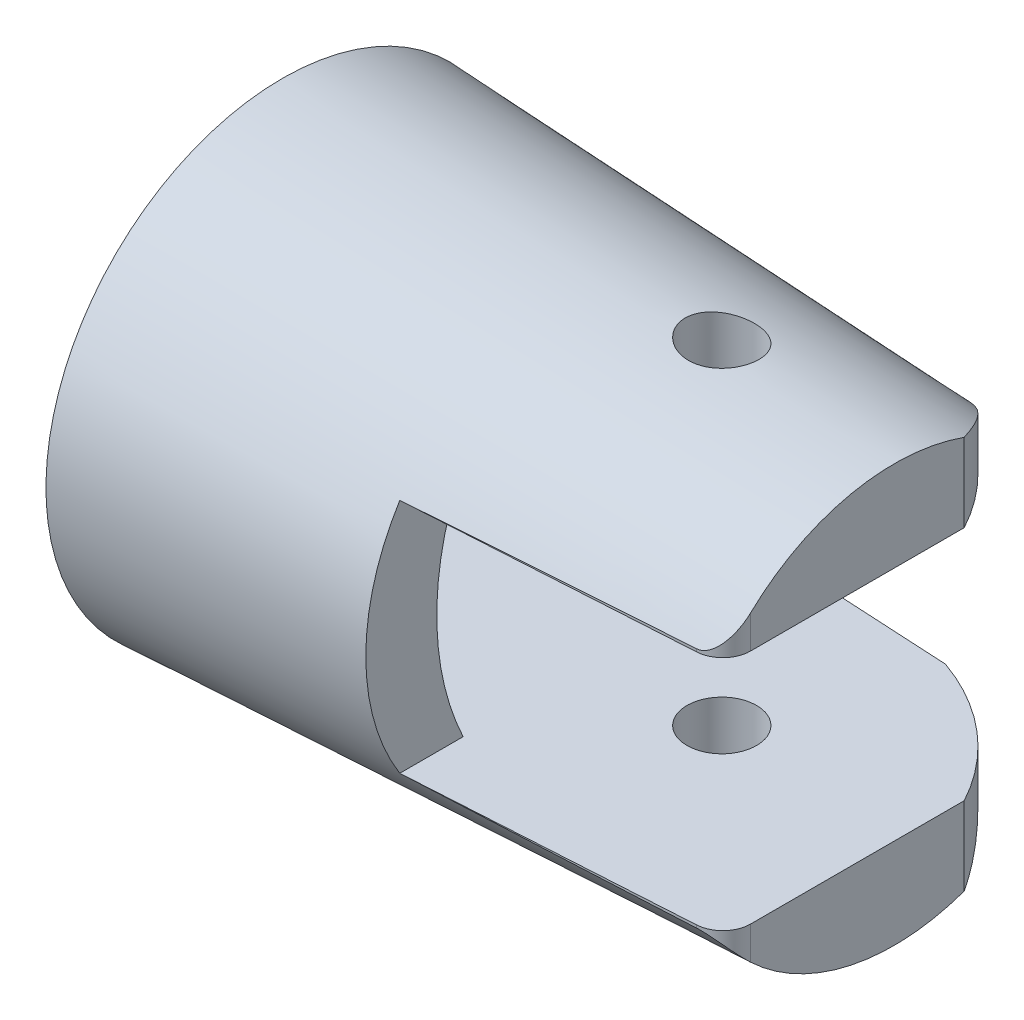
ISO-10303-21;
HEADER;
FILE_DESCRIPTION(('STEP AP214'),'2;1');
FILE_NAME('part.step','',(''),(''),'','','');
FILE_SCHEMA(('AUTOMOTIVE_DESIGN { 1 0 10303 214 1 1 1 1 }'));
ENDSEC;
DATA;
#1=APPLICATION_CONTEXT('core data for automotive mechanical design processes');
#2=APPLICATION_PROTOCOL_DEFINITION('international standard','automotive_design',2000,#1);
#3=PRODUCT_CONTEXT('',#1,'mechanical');
#4=PRODUCT('Part','Part','',(#3));
#5=PRODUCT_RELATED_PRODUCT_CATEGORY('part','',(#4));
#6=PRODUCT_DEFINITION_FORMATION('','',#4);
#7=PRODUCT_DEFINITION_CONTEXT('part definition',#1,'design');
#8=PRODUCT_DEFINITION('design','',#6,#7);
#9=PRODUCT_DEFINITION_SHAPE('','',#8);
#10=(LENGTH_UNIT() NAMED_UNIT(*) SI_UNIT(.MILLI.,.METRE.));
#11=(NAMED_UNIT(*) PLANE_ANGLE_UNIT() SI_UNIT($,.RADIAN.));
#12=(NAMED_UNIT(*) SI_UNIT($,.STERADIAN.) SOLID_ANGLE_UNIT());
#13=UNCERTAINTY_MEASURE_WITH_UNIT(LENGTH_MEASURE(1.E-05),#10,'distance_accuracy_value','');
#14=(GEOMETRIC_REPRESENTATION_CONTEXT(3) GLOBAL_UNCERTAINTY_ASSIGNED_CONTEXT((#13)) GLOBAL_UNIT_ASSIGNED_CONTEXT((#10,
#11,#12)) REPRESENTATION_CONTEXT('',''));
#15=CARTESIAN_POINT('',(0.,0.,0.));
#16=DIRECTION('',(0.,0.,1.));
#17=DIRECTION('',(1.,0.,0.));
#18=AXIS2_PLACEMENT_3D('',#15,#16,#17);
#19=CARTESIAN_POINT('',(11.605,4.48375,10.55));
#20=DIRECTION('',(1.,0.,0.));
#21=DIRECTION('',(0.,1.,0.));
#22=AXIS2_PLACEMENT_3D('',#19,#20,#21);
#23=PLANE('',#22);
#24=CARTESIAN_POINT('',(11.605,0.,4.80228983734721));
#25=DIRECTION('',(1.,0.,0.));
#26=DIRECTION('',(0.,1.,0.));
#27=AXIS2_PLACEMENT_3D('',#24,#25,#26);
#28=CIRCLE('',#27,10.55);
#29=CARTESIAN_POINT('',(11.605,-4.48375,-4.7475));
#30=VERTEX_POINT('',#29);
#31=CARTESIAN_POINT('',(11.605,4.48375,-4.7475));
#32=VERTEX_POINT('',#31);
#33=EDGE_CURVE('E359',#30,#32,#28,.T.);
#34=ORIENTED_EDGE('',*,*,#33,.F.);
#35=DIRECTION('',(0.,0.,-1.));
#36=VECTOR('',#35,1.);
#37=CARTESIAN_POINT('',(11.605,-4.48375,10.55));
#38=LINE('',#37,#36);
#39=CARTESIAN_POINT('',(11.605,-4.48375,-7.15049550293544));
#40=VERTEX_POINT('',#39);
#41=EDGE_CURVE('E238',#30,#40,#38,.T.);
#42=ORIENTED_EDGE('',*,*,#41,.T.);
#43=CARTESIAN_POINT('',(11.605,0.,0.));
#44=DIRECTION('',(1.,0.,0.));
#45=DIRECTION('',(0.,1.,0.));
#46=AXIS2_PLACEMENT_3D('',#43,#44,#45);
#47=CIRCLE('',#46,8.44);
#48=CARTESIAN_POINT('',(11.605,4.48375,-7.15049550293544));
#49=VERTEX_POINT('',#48);
#50=EDGE_CURVE('E272',#49,#40,#47,.F.);
#51=ORIENTED_EDGE('',*,*,#50,.F.);
#52=DIRECTION('',(0.,0.,-1.));
#53=VECTOR('',#52,1.);
#54=CARTESIAN_POINT('',(11.605,4.48375,10.55));
#55=LINE('',#54,#53);
#56=EDGE_CURVE('E243',#32,#49,#55,.T.);
#57=ORIENTED_EDGE('',*,*,#56,.F.);
#58=EDGE_LOOP('',(#34,#42,#51,#57));
#59=FACE_BOUND('',#58,.T.);
#60=ADVANCED_FACE('F37',(#59),#23,.T.);
#61=CARTESIAN_POINT('',(23.21,0.,0.));
#62=DIRECTION('',(-1.,0.,0.));
#63=DIRECTION('',(0.,0.,1.));
#64=AXIS2_PLACEMENT_3D('',#61,#62,#63);
#65=CONICAL_SURFACE('',#64,7.9125,0.0454232794215771);
#66=CARTESIAN_POINT('',(15.1858396501831,8.15167568168337,-1.43624356024557));
#67=CARTESIAN_POINT('',(15.2370004563784,8.13983552996084,-1.49004217112614));
#68=CARTESIAN_POINT('',(15.2927393141018,8.12798256081846,-1.53954181023076));
#69=CARTESIAN_POINT('',(15.4118997617179,8.10509305188235,-1.62855616542442));
#70=CARTESIAN_POINT('',(15.4753283241469,8.09405726788451,-1.66806171781851));
#71=CARTESIAN_POINT('',(15.6081979273132,8.07360103223588,-1.73591017967118));
#72=CARTESIAN_POINT('',(15.677642230045,8.06418146532364,-1.76424698614976));
#73=CARTESIAN_POINT('',(15.8205644280359,8.04765002236663,-1.80878908623121));
#74=CARTESIAN_POINT('',(15.8940409872507,8.04053738727865,-1.82499837241608));
#75=CARTESIAN_POINT('',(16.0415646442821,8.02920051089732,-1.844523611435));
#76=CARTESIAN_POINT('',(16.1155781101773,8.02492694790153,-1.84806468641644));
#77=CARTESIAN_POINT('',(16.2632622771999,8.01927436095525,-1.84269343420077));
#78=CARTESIAN_POINT('',(16.3369330080211,8.01789508140986,-1.83378220678537));
#79=CARTESIAN_POINT('',(16.4802565925753,8.01795748284653,-1.80405536667388));
#80=CARTESIAN_POINT('',(16.5499607184408,8.01934228220191,-1.78348590385744));
#81=CARTESIAN_POINT('',(16.6849734601956,8.02450582453385,-1.73123513104993));
#82=CARTESIAN_POINT('',(16.7502819720467,8.02828462415115,-1.69955355816031));
#83=CARTESIAN_POINT('',(16.8750432012333,8.03775626509899,-1.62581414792952));
#84=CARTESIAN_POINT('',(16.9344644062042,8.04345875512816,-1.58370429408504));
#85=CARTESIAN_POINT('',(17.0455074631975,8.05613940957238,-1.49037785499776));
#86=CARTESIAN_POINT('',(17.0971284700536,8.06311771204337,-1.4391602842233));
#87=CARTESIAN_POINT('',(17.1921579840317,8.07781192096843,-1.32792116728208));
#88=CARTESIAN_POINT('',(17.2353861567508,8.08553958274295,-1.26774704540646));
#89=CARTESIAN_POINT('',(17.3111829142298,8.10091574120568,-1.14101117191744));
#90=CARTESIAN_POINT('',(17.3437508920379,8.10856423336226,-1.07444905687436));
#91=CARTESIAN_POINT('',(17.3975648174849,8.12323984995256,-0.936108670582175));
#92=CARTESIAN_POINT('',(17.4187034035083,8.13026058214658,-0.864287896503543));
#93=CARTESIAN_POINT('',(17.4485503891946,8.14312040365657,-0.71800574557608));
#94=CARTESIAN_POINT('',(17.457259348639,8.14895954617654,-0.643544487799061));
#95=CARTESIAN_POINT('',(17.4619289757515,8.15913529663169,-0.494627783195011));
#96=CARTESIAN_POINT('',(17.4579756580849,8.16348182125992,-0.420175718371018));
#97=CARTESIAN_POINT('',(17.4375782627401,8.1706580369122,-0.272928908851256));
#98=CARTESIAN_POINT('',(17.4211347169992,8.17348779252407,-0.200134093712075));
#99=CARTESIAN_POINT('',(17.3763827419443,8.1777556789681,-0.0588706021815339));
#100=CARTESIAN_POINT('',(17.3481673764158,8.17920443864078,0.00962726207078582));
#101=CARTESIAN_POINT('',(17.2806761587105,8.18106425935975,0.140953244866746));
#102=CARTESIAN_POINT('',(17.2414001728411,8.18147530786237,0.203781294865778));
#103=CARTESIAN_POINT('',(17.1528499750947,8.18170304761177,0.322050470215346));
#104=CARTESIAN_POINT('',(17.1035650592015,8.18151909937075,0.377483581021157));
#105=CARTESIAN_POINT('',(16.9964133381521,8.18106454568311,0.479320737823932));
#106=CARTESIAN_POINT('',(16.9385463901569,8.18079393879406,0.525724633509471));
#107=CARTESIAN_POINT('',(16.8156675235199,8.18066898020001,0.608324457497011));
#108=CARTESIAN_POINT('',(16.7506336799156,8.18081594192099,0.644487781889523));
#109=CARTESIAN_POINT('',(16.6154242687479,8.1819599068496,0.705380557509855));
#110=CARTESIAN_POINT('',(16.5452488145522,8.18295689132019,0.730110260750423));
#111=CARTESIAN_POINT('',(16.4019022602468,8.18608872220152,0.767400193608259));
#112=CARTESIAN_POINT('',(16.3287370936064,8.18822140713218,0.779983413041984));
#113=CARTESIAN_POINT('',(16.1813800547276,8.19372765400863,0.79271977623501));
#114=CARTESIAN_POINT('',(16.1071881911193,8.19710120553021,0.792873024413046));
#115=CARTESIAN_POINT('',(15.9599827456488,8.20498299304713,0.780781398250567));
#116=CARTESIAN_POINT('',(15.8869677589433,8.20948975003676,0.76855262185225));
#117=CARTESIAN_POINT('',(15.7440566815771,8.21934247064853,0.73209487338256));
#118=CARTESIAN_POINT('',(15.6741607255647,8.22468847045578,0.707865383786777));
#119=CARTESIAN_POINT('',(15.5390621945342,8.2357860033347,0.647940166117355));
#120=CARTESIAN_POINT('',(15.4738861977817,8.24153951884773,0.612184884343853));
#121=CARTESIAN_POINT('',(15.3504384944313,8.25283919050856,0.530239197728645));
#122=CARTESIAN_POINT('',(15.292167045898,8.25838533890049,0.48404840303626));
#123=CARTESIAN_POINT('',(15.1839716720138,8.26864309749103,0.382320541300553));
#124=CARTESIAN_POINT('',(15.1340773949218,8.27335174698543,0.326751618761924));
#125=CARTESIAN_POINT('',(15.0443274304,8.28127027219959,0.207929292879948));
#126=CARTESIAN_POINT('',(15.004471133547,8.28448023891709,0.144676356392206));
#127=CARTESIAN_POINT('',(14.9362890424323,8.28882712844238,0.012890883154139));
#128=CARTESIAN_POINT('',(14.9078625085861,8.28998248468784,-0.0555888988721689));
#129=CARTESIAN_POINT('',(14.8628728627201,8.28988845871902,-0.196334090027352));
#130=CARTESIAN_POINT('',(14.8463081875326,8.28863939344189,-0.268598999000912));
#131=CARTESIAN_POINT('',(14.8256436787778,8.28359202889649,-0.413795484846196));
#132=CARTESIAN_POINT('',(14.8213777545527,8.27982855124995,-0.486704709338493));
#133=CARTESIAN_POINT('',(14.824893465141,8.26984141139194,-0.632072944878404));
#134=CARTESIAN_POINT('',(14.8326772612207,8.26361730798595,-0.704531872819225));
#135=CARTESIAN_POINT('',(14.8600057929374,8.24897272040385,-0.847121332179731));
#136=CARTESIAN_POINT('',(14.879576293983,8.24054744744441,-0.917246406447483));
#137=CARTESIAN_POINT('',(14.9298516969279,8.22198642435422,-1.05309384329374));
#138=CARTESIAN_POINT('',(14.9605483521402,8.21185194405217,-1.11881942413581));
#139=CARTESIAN_POINT('',(15.0226828004601,8.1933248803773,-1.22762538029722));
#140=CARTESIAN_POINT('',(15.0517838874756,8.18517911216169,-1.27210213286072));
#141=CARTESIAN_POINT('',(15.1150912289383,8.16858297660277,-1.3571982600399));
#142=CARTESIAN_POINT('',(15.149297661593,8.16013259863456,-1.39781749992399));
#143=CARTESIAN_POINT('',(15.1858396501831,8.15167568168337,-1.43624356024557));
#144=B_SPLINE_CURVE_WITH_KNOTS('',3,(#66,#67,#68,#69,#70,#71,#72,#73,#74,#75,#76,#77,#78,#79,
#80,#81,#82,#83,#84,#85,#86,#87,#88,#89,#90,#91,#92,#93,#94,#95,#96,#97,#98,#99,#100,#101,#102,
#103,#104,#105,#106,#107,#108,#109,#110,#111,#112,#113,#114,#115,#116,#117,#118,#119,#120,#121,
#122,#123,#124,#125,#126,#127,#128,#129,#130,#131,#132,#133,#134,#135,#136,#137,#138,#139,#140,
#141,#142,#143),.UNSPECIFIED.,.T.,.F.,(4,2,2,2,2,2,2,2,2,2,2,2,2,2,2,2,2,2,2,2,2,2,2,2,2,2,2,2,
2,2,2,2,2,2,2,2,2,2,4),(0.,0.225346924435873,0.4508997292587,0.676575613445299,
0.902177168634298,1.12374915677973,1.34530157702449,1.56234169770261,1.77938695362364,
1.99753744758064,2.2157115616382,2.43815205342912,2.6606052079537,2.88511318562996,
3.10961105202946,3.33258715023471,3.55555375280687,3.77679009594425,3.99802911333637,
4.21950599193918,4.44098655720325,4.66316454092894,4.88533762731256,5.10708937429825,
5.32883925844463,5.55030121398688,5.77177272079048,5.99440742260724,6.21705044300371,
6.44046554402201,6.6638670778505,6.88525400147179,7.10661174512756,7.32496579210152,
7.54335900810845,7.76223136720015,7.98094182910126,8.14189193638805,8.30284766312382),.UNSPECIFIED.);
#145=CARTESIAN_POINT('',(15.1858396501831,8.15167568168337,-1.43624356024557));
#146=VERTEX_POINT('',#145);
#147=EDGE_CURVE('E175',#146,#146,#144,.T.);
#148=ORIENTED_EDGE('',*,*,#147,.T.);
#149=EDGE_LOOP('',(#148));
#150=FACE_BOUND('',#149,.T.);
#151=CARTESIAN_POINT('',(0.,0.,0.));
#152=DIRECTION('',(1.,0.,0.));
#153=DIRECTION('',(0.,0.,-1.));
#154=AXIS2_PLACEMENT_3D('',#151,#152,#153);
#155=CIRCLE('',#154,8.9675);
#156=CARTESIAN_POINT('',(0.,0.,-8.9675));
#157=VERTEX_POINT('',#156);
#158=EDGE_CURVE('E319',#157,#157,#155,.T.);
#159=ORIENTED_EDGE('',*,*,#158,.T.);
#160=EDGE_LOOP('',(#159));
#161=FACE_BOUND('',#160,.T.);
#162=CARTESIAN_POINT('',(23.21,0.,0.));
#163=DIRECTION('',(1.,0.,0.));
#164=DIRECTION('',(0.,0.,-1.));
#165=AXIS2_PLACEMENT_3D('',#162,#163,#164);
#166=CIRCLE('',#165,7.9125);
#167=CARTESIAN_POINT('',(23.21,-5.73795701650356,5.44825798173511));
#168=VERTEX_POINT('',#167);
#169=CARTESIAN_POINT('',(23.2099999999997,-7.45343900466346,-2.65591853296774));
#170=VERTEX_POINT('',#169);
#171=EDGE_CURVE('E42',#168,#170,#166,.T.);
#172=ORIENTED_EDGE('',*,*,#171,.F.);
#173=CARTESIAN_POINT('',(23.2099999999997,-5.73795658073713,5.44825756802812));
#174=CARTESIAN_POINT('',(23.2099873435078,-5.69829167615779,5.490040708501));
#175=CARTESIAN_POINT('',(23.2075181147614,-5.65825405282361,5.53144835750299));
#176=CARTESIAN_POINT('',(23.1978334146786,-5.57771691653059,5.6132658888394));
#177=CARTESIAN_POINT('',(23.1906170097798,-5.5372173142604,5.65367557329566));
#178=CARTESIAN_POINT('',(23.1715209184877,-5.45569667748399,5.7335855863338));
#179=CARTESIAN_POINT('',(23.1596005513278,-5.41467419929677,5.77307471074845));
#180=CARTESIAN_POINT('',(23.1311679085698,-5.33280916851281,5.85052963373975));
#181=CARTESIAN_POINT('',(23.1146565523307,-5.29196658155403,5.88849573556619));
#182=CARTESIAN_POINT('',(23.0657405448478,-5.18650523429233,5.98492596375282));
#183=CARTESIAN_POINT('',(23.0297387777277,-5.12229033698875,6.04205464482065));
#184=CARTESIAN_POINT('',(22.9452512332614,-4.99754300857152,6.1505748965919));
#185=CARTESIAN_POINT('',(22.8968103658084,-4.93699827904275,6.2019861717939));
#186=CARTESIAN_POINT('',(22.8086335467606,-4.84682764606409,6.27748965197365));
#187=CARTESIAN_POINT('',(22.7735578666197,-4.81475498818741,6.30409890090519));
#188=CARTESIAN_POINT('',(22.6979734513121,-4.75452634330211,6.35393570306184));
#189=CARTESIAN_POINT('',(22.6574695878178,-4.72636688991261,6.37716625005794));
#190=CARTESIAN_POINT('',(22.5805619562601,-4.68168332406099,6.41433781543735));
#191=CARTESIAN_POINT('',(22.5453013700123,-4.66396797599065,6.42919165616178));
#192=CARTESIAN_POINT('',(22.4715895949019,-4.6333859690069,6.45539083211337));
#193=CARTESIAN_POINT('',(22.4331499514225,-4.62050263047631,6.46674821198372));
#194=CARTESIAN_POINT('',(22.3654654176334,-4.60375420688302,6.48245009914256));
#195=CARTESIAN_POINT('',(22.336851140301,-4.598350135407,6.48787497792098));
#196=CARTESIAN_POINT('',(22.2786781388191,-4.59087302296667,6.49640425908696));
#197=CARTESIAN_POINT('',(22.2491147387235,-4.5888203859331,6.49949438651671));
#198=CARTESIAN_POINT('',(22.2194062092093,-4.58862247704191,6.50129060783859));
#199=B_SPLINE_CURVE_WITH_KNOTS('',3,(#173,#174,#175,#176,#177,#178,#179,#180,#181,#182,#183,
#184,#185,#186,#187,#188,#189,#190,#191,#192,#193,#194,#195,#196,#197,#198),.UNSPECIFIED.,.F.,
.F.,(4,2,2,2,2,2,2,2,2,2,2,2,4),(0.,0.172758363408524,0.345550711004406,0.519871353961681,
0.694157113804421,0.972780628280163,1.25041201243581,1.41344469603666,1.57633202927326,
1.70239504126686,1.82801880123566,1.91660354228508,2.00572561358504),.UNSPECIFIED.);
#200=CARTESIAN_POINT('',(22.2194062092093,-4.58862247704208,6.5012906078386));
#201=VERTEX_POINT('',#200);
#202=EDGE_CURVE('E311',#168,#201,#199,.T.);
#203=ORIENTED_EDGE('',*,*,#202,.T.);
#204=CARTESIAN_POINT('',(43.6734662378205,0.,5.18910408362288));
#205=DIRECTION('',(0.0610485395348605,0.,0.998134798421867));
#206=DIRECTION('',(-0.998134798421867,0.,0.0610485395348605));
#207=AXIS2_PLACEMENT_3D('',#204,#205,#206);
#208=ELLIPSE('',#207,114.373619695667,4.67186309847787);
#209=CARTESIAN_POINT('',(11.605,-4.48375,7.15049550293544));
#210=VERTEX_POINT('',#209);
#211=EDGE_CURVE('E382',#201,#210,#208,.F.);
#212=ORIENTED_EDGE('',*,*,#211,.T.);
#213=CARTESIAN_POINT('',(11.605,4.48375,7.15049550293544));
#214=VERTEX_POINT('',#213);
#215=EDGE_CURVE('E267',#210,#214,#47,.F.);
#216=ORIENTED_EDGE('',*,*,#215,.T.);
#217=CARTESIAN_POINT('',(22.2194062092094,4.58862247704208,6.50129060783859));
#218=VERTEX_POINT('',#217);
#219=EDGE_CURVE('E379',#214,#218,#208,.F.);
#220=ORIENTED_EDGE('',*,*,#219,.T.);
#221=CARTESIAN_POINT('',(22.2194062092093,4.58862247704208,6.5012906078386));
#222=CARTESIAN_POINT('',(22.2378248772701,4.58876227202593,6.50016667125573));
#223=CARTESIAN_POINT('',(22.2561980617859,4.58959806944525,6.49855498749577));
#224=CARTESIAN_POINT('',(22.2927068367869,4.59261202585029,6.49439316470295));
#225=CARTESIAN_POINT('',(22.3108426657059,4.59478871191627,6.49184405663484));
#226=CARTESIAN_POINT('',(22.3643363987134,4.60319594194533,6.48290731205762));
#227=CARTESIAN_POINT('',(22.3991945502207,4.61130923462563,6.47520354399213));
#228=CARTESIAN_POINT('',(22.4751051171065,4.63437676468309,6.45447402092479));
#229=CARTESIAN_POINT('',(22.5155519711154,4.65052800308473,6.44060252067628));
#230=CARTESIAN_POINT('',(22.5926076800542,4.68788110610957,6.40912732822089));
#231=CARTESIAN_POINT('',(22.6291980196732,4.70910586727861,6.39150675746251));
#232=CARTESIAN_POINT('',(22.7160452692916,4.76685966281137,6.34370002451388));
#233=CARTESIAN_POINT('',(22.7637570126459,4.80567386047935,6.31168805722797));
#234=CARTESIAN_POINT('',(22.8509949304972,4.88807617829244,6.24305742494902));
#235=CARTESIAN_POINT('',(22.8905037402987,4.93167413303447,6.20642924594764));
#236=CARTESIAN_POINT('',(22.9536387684946,5.01096835190791,6.13876469191634));
#237=CARTESIAN_POINT('',(22.9788090919515,5.04608444364407,6.10846413376488));
#238=CARTESIAN_POINT('',(23.0251311884172,5.11739302367972,6.04609332740528));
#239=CARTESIAN_POINT('',(23.0462808327153,5.15358607050086,6.01402215329146));
#240=CARTESIAN_POINT('',(23.1039557444487,5.26312745116149,5.91549215908941));
#241=CARTESIAN_POINT('',(23.1347359210703,5.33747587198519,5.84668490481235));
#242=CARTESIAN_POINT('',(23.1750758741127,5.46672908289592,5.72306189828252));
#243=CARTESIAN_POINT('',(23.1880832077385,5.52162189539187,5.66930655745777));
#244=CARTESIAN_POINT('',(23.2055041049529,5.63054328001944,5.56002273060542));
#245=CARTESIAN_POINT('',(23.2099525626018,5.68457446683685,5.50450238635427));
#246=CARTESIAN_POINT('',(23.2099999999995,5.73795676515448,5.44825737380479));
#247=B_SPLINE_CURVE_WITH_KNOTS('',3,(#221,#222,#223,#224,#225,#226,#227,#228,#229,#230,#231,
#232,#233,#234,#235,#236,#237,#238,#239,#240,#241,#242,#243,#244,#245,#246),.UNSPECIFIED.,.F.,
.F.,(4,2,2,2,2,2,2,2,2,2,2,2,4),(0.,0.0553224032580019,0.110584144867017,0.219880700820362,
0.356261345164135,0.493269491414394,0.700140034539236,0.907444132319289,1.06555194490605,
1.22374323447096,1.53995568823358,1.77327779086745,2.00564661970283),.UNSPECIFIED.);
#248=CARTESIAN_POINT('',(23.21,5.73795730313656,5.44825788468637));
#249=VERTEX_POINT('',#248);
#250=EDGE_CURVE('E388',#218,#249,#247,.T.);
#251=ORIENTED_EDGE('',*,*,#250,.T.);
#252=CARTESIAN_POINT('',(23.2099999999998,7.45343900466352,-2.65591853296756));
#253=VERTEX_POINT('',#252);
#254=EDGE_CURVE('E278',#253,#249,#166,.T.);
#255=ORIENTED_EDGE('',*,*,#254,.F.);
#256=CARTESIAN_POINT('',(23.210325005819,7.45363796487592,-2.65531609345926));
#257=CARTESIAN_POINT('',(23.0919762340941,7.38119951516062,-2.8747195945395));
#258=CARTESIAN_POINT('',(22.9654832397635,7.30097184704305,-3.08689514184096));
#259=CARTESIAN_POINT('',(22.6981523374623,7.12769181213734,-3.4959314358509));
#260=CARTESIAN_POINT('',(22.5573386787829,7.03466103359818,-3.6928171076932));
#261=CARTESIAN_POINT('',(22.2633452117923,6.83856394265192,-4.0705824700946));
#262=CARTESIAN_POINT('',(22.110203715806,6.73552853126478,-4.25150834664549));
#263=CARTESIAN_POINT('',(21.7924163411167,6.52156570200012,-4.5980546488286));
#264=CARTESIAN_POINT('',(21.6277654685477,6.41063485794542,-4.76366835728053));
#265=CARTESIAN_POINT('',(21.2891307164744,6.18407103641313,-5.07853960388361));
#266=CARTESIAN_POINT('',(21.1152180990254,6.06847526172439,-5.22790093035928));
#267=CARTESIAN_POINT('',(20.757602349289,5.83426616005032,-5.5117373435453));
#268=CARTESIAN_POINT('',(20.5738999223573,5.71565305078493,-5.64621350058968));
#269=CARTESIAN_POINT('',(20.1970199358451,5.4781351560121,-5.90032870201739));
#270=CARTESIAN_POINT('',(20.0038515413684,5.3592307545368,-6.01998171722996));
#271=CARTESIAN_POINT('',(19.6075733362901,5.12411938384509,-6.24463556066053));
#272=CARTESIAN_POINT('',(19.4044642249923,5.00791222573003,-6.34963741755416));
#273=CARTESIAN_POINT('',(19.0595956896924,4.82127386146531,-6.51103231313013));
#274=CARTESIAN_POINT('',(18.9208757226696,4.74889462892207,-6.5716884529434));
#275=CARTESIAN_POINT('',(18.6386381378196,4.60859380299095,-6.68641321830112));
#276=CARTESIAN_POINT('',(18.4951234874055,4.54066952685196,-6.7404858255325));
#277=CARTESIAN_POINT('',(18.2027678172911,4.41099882802579,-6.84186028025619));
#278=CARTESIAN_POINT('',(18.0539219945767,4.34925817662217,-6.88915581999984));
#279=CARTESIAN_POINT('',(17.7506226327114,4.23432599309434,-6.97653256705472));
#280=CARTESIAN_POINT('',(17.5961599591839,4.18114922686628,-7.01660132787996));
#281=CARTESIAN_POINT('',(17.438939,4.13351579196366,-7.05278277252763));
#282=B_SPLINE_CURVE_WITH_KNOTS('',3,(#256,#257,#258,#259,#260,#261,#262,#263,#264,#265,#266,
#267,#268,#269,#270,#271,#272,#273,#274,#275,#276,#277,#278,#279,#280,#281),.UNSPECIFIED.,.F.,
.F.,(4,2,2,2,2,2,2,2,2,2,2,2,4),(0.,0.77813280913382,1.55496927131995,2.32947836705291,
3.10432563010617,3.87389160425643,4.64340220594535,5.4121819342081,6.18090765832257,
6.68413025439674,7.18704697606434,7.69042878810341,8.19466945033485),.UNSPECIFIED.);
#283=CARTESIAN_POINT('',(18.3667461901521,4.48375,-6.7849795733042));
#284=VERTEX_POINT('',#283);
#285=EDGE_CURVE('E233',#253,#284,#282,.T.);
#286=ORIENTED_EDGE('',*,*,#285,.T.);
#287=CARTESIAN_POINT('',(44.5726728138678,4.48375,-5.29905497351199));
#288=CARTESIAN_POINT('',(42.3632557991479,4.48375,-5.43057600760555));
#289=CARTESIAN_POINT('',(40.1537228781907,4.48375,-5.56013068389907));
#290=CARTESIAN_POINT('',(35.7344699549912,4.48375,-5.81592825272661));
#291=CARTESIAN_POINT('',(33.5247499531615,4.48375,-5.94217115238377));
#292=CARTESIAN_POINT('',(27.8927760109839,4.48375,-6.26049054385434));
#293=CARTESIAN_POINT('',(24.4704159019874,4.48375,-6.45068613810378));
#294=CARTESIAN_POINT('',(17.6254235537313,4.48375,-6.82613940047241));
#295=CARTESIAN_POINT('',(14.2027913143114,4.48375,-7.01139706565928));
#296=CARTESIAN_POINT('',(7.35729570575324,4.48375,-7.3780377606581));
#297=CARTESIAN_POINT('',(3.93443233516793,4.48375,-7.55942076340467));
#298=CARTESIAN_POINT('',(-2.91145568007267,4.48375,-7.91902922244784));
#299=CARTESIAN_POINT('',(-6.33448032450071,4.48375,-8.09725468306763));
#300=CARTESIAN_POINT('',(-9.7575673138679,4.48375,-8.27426083109337));
#301=B_SPLINE_CURVE_WITH_KNOTS('',3,(#287,#288,#289,#290,#291,#292,#293,#294,#295,#296,#297,
#298,#299,#300),.UNSPECIFIED.,.F.,.F.,(4,2,2,2,2,2,4),(0.,6.639981763878,13.2799492449581,
23.5628674158611,33.8457916930049,44.1287877751667,54.4117697771162),.UNSPECIFIED.);
#302=EDGE_CURVE('E269',#284,#49,#301,.T.);
#303=ORIENTED_EDGE('',*,*,#302,.T.);
#304=ORIENTED_EDGE('',*,*,#50,.T.);
#305=CARTESIAN_POINT('',(-9.75756731386789,-4.48375,-8.27426083109337));
#306=CARTESIAN_POINT('',(-6.76081513792659,-4.48375,-8.11931135386581));
#307=CARTESIAN_POINT('',(-3.76411162587657,-4.48375,-7.96341368107027));
#308=CARTESIAN_POINT('',(2.22916595103775,-4.48375,-7.64926372516363));
#309=CARTESIAN_POINT('',(5.22574001614723,-4.48375,-7.49101144672747));
#310=CARTESIAN_POINT('',(11.2518734534107,-4.48375,-7.16992795627611));
#311=CARTESIAN_POINT('',(14.2814311613988,-4.48375,-7.00706546151416));
#312=CARTESIAN_POINT('',(20.3403534260021,-4.48375,-6.6777987846476));
#313=CARTESIAN_POINT('',(23.3697179826739,-4.48375,-6.51139460358648));
#314=CARTESIAN_POINT('',(29.4282131322181,-4.48375,-6.17415191948558));
#315=CARTESIAN_POINT('',(32.4573437241116,-4.48375,-6.00331339880318));
#316=CARTESIAN_POINT('',(37.0007957088804,-4.48375,-5.74277052608293));
#317=CARTESIAN_POINT('',(38.515239970922,-4.48375,-5.65520866553543));
#318=CARTESIAN_POINT('',(41.5440323218638,-4.48375,-5.47842983401376));
#319=CARTESIAN_POINT('',(43.058380410734,-4.48375,-5.38921286252695));
#320=CARTESIAN_POINT('',(44.5726728138679,-4.48375,-5.29905497351199));
#321=B_SPLINE_CURVE_WITH_KNOTS('',3,(#305,#306,#307,#308,#309,#310,#311,#312,#313,#314,#315,
#316,#317,#318,#319,#320),.UNSPECIFIED.,.F.,.F.,(4,2,2,2,2,2,2,4),(0.,9.00226657237608,
18.0045152736493,27.1063098999938,36.2081018447502,45.3099300077749,49.860849604712,
54.4117706112821),.UNSPECIFIED.);
#322=CARTESIAN_POINT('',(18.3667461901521,-4.48375,-6.78497957330422));
#323=VERTEX_POINT('',#322);
#324=EDGE_CURVE('E323',#40,#323,#321,.T.);
#325=ORIENTED_EDGE('',*,*,#324,.T.);
#326=CARTESIAN_POINT('',(17.438939,-4.13351579196366,-7.05278277252763));
#327=CARTESIAN_POINT('',(17.5611640324969,-4.17051912824978,-7.02466242031246));
#328=CARTESIAN_POINT('',(17.6817449358886,-4.2109123743094,-6.99417797749322));
#329=CARTESIAN_POINT('',(17.9195480311539,-4.29724635599424,-6.92874817808816));
#330=CARTESIAN_POINT('',(18.0367731266581,-4.34318210468028,-6.89380683006655));
#331=CARTESIAN_POINT('',(18.2676708478635,-4.43929697022611,-6.81978887774733));
#332=CARTESIAN_POINT('',(18.3813529437458,-4.48946315274835,-6.78072479254048));
#333=CARTESIAN_POINT('',(18.6056767122745,-4.59319654868767,-6.69853248715376));
#334=CARTESIAN_POINT('',(18.7163176139707,-4.64676461330263,-6.65540324849885));
#335=CARTESIAN_POINT('',(19.0442903443284,-4.81149254684378,-6.51993853368699));
#336=CARTESIAN_POINT('',(19.2572624696939,-4.92649893311556,-6.42165863521768));
#337=CARTESIAN_POINT('',(19.6726620584442,-5.1616018573539,-6.20974089659248));
#338=CARTESIAN_POINT('',(19.8750802499675,-5.28170270838642,-6.09608985735256));
#339=CARTESIAN_POINT('',(20.2675599867085,-5.5217923163065,-5.85495100421384));
#340=CARTESIAN_POINT('',(20.4577357724687,-5.64176685064295,-5.72763502370632));
#341=CARTESIAN_POINT('',(20.8282407962681,-5.8800036695,-5.45806481916953));
#342=CARTESIAN_POINT('',(21.0085724033651,-5.99826636090621,-5.31581421354693));
#343=CARTESIAN_POINT('',(21.358646162175,-6.23028486872024,-5.0165415132687));
#344=CARTESIAN_POINT('',(21.5284148465312,-6.34405169187285,-4.85955913843649));
#345=CARTESIAN_POINT('',(21.8570791033664,-6.56500787730951,-4.53040263170399));
#346=CARTESIAN_POINT('',(22.0159769177326,-6.67219859530265,-4.35823164900331));
#347=CARTESIAN_POINT('',(22.3637060352895,-6.90578347718049,-3.9493590892156));
#348=CARTESIAN_POINT('',(22.5488566398145,-7.02942441309382,-3.70787760460673));
#349=CARTESIAN_POINT('',(22.8971602302801,-7.25745960564561,-3.19999755740193));
#350=CARTESIAN_POINT('',(23.0602444447869,-7.36179404750652,-2.93352528836615));
#351=CARTESIAN_POINT('',(23.210325005819,-7.45363796487592,-2.65531609345926));
#352=B_SPLINE_CURVE_WITH_KNOTS('',3,(#326,#327,#328,#329,#330,#331,#332,#333,#334,#335,#336,
#337,#338,#339,#340,#341,#342,#343,#344,#345,#346,#347,#348,#349,#350,#351),.UNSPECIFIED.,.F.,
.F.,(4,2,2,2,2,2,2,2,2,2,2,2,4),(0.,0.392113399266298,0.783876584089681,1.17448262305159,
1.56518678508302,2.3479873123158,3.13146434351286,3.90604198180623,4.68043238425816,
5.45279178499311,6.22499141975077,7.20813800272807,8.19428132646489),.UNSPECIFIED.);
#353=EDGE_CURVE('E400',#323,#170,#352,.T.);
#354=ORIENTED_EDGE('',*,*,#353,.T.);
#355=EDGE_LOOP('',(#172,#203,#212,#216,#220,#251,#255,#286,#303,#304,#325,#354));
#356=FACE_BOUND('',#355,.T.);
#357=CARTESIAN_POINT('',(15.1858396501831,-8.15167568168337,-1.43624356024557));
#358=CARTESIAN_POINT('',(15.1346599827203,-8.16352081114719,-1.38241796390753));
#359=CARTESIAN_POINT('',(15.0880063435261,-8.17536576067255,-1.32423065231404));
#360=CARTESIAN_POINT('',(15.0050685321053,-8.19823268542422,-1.20067894056246));
#361=CARTESIAN_POINT('',(14.968793829915,-8.20925390232388,-1.13530806069391));
#362=CARTESIAN_POINT('',(14.9077120279867,-8.2297341939526,-0.999132624419495));
#363=CARTESIAN_POINT('',(14.8829103136408,-8.23919253373476,-0.928325534415233));
#364=CARTESIAN_POINT('',(14.8456346701432,-8.25594323149194,-0.78330664665395));
#365=CARTESIAN_POINT('',(14.8331569275094,-8.26323625900394,-0.709095909550948));
#366=CARTESIAN_POINT('',(14.821098542575,-8.27517301187549,-0.560636289624839));
#367=CARTESIAN_POINT('',(14.8213128990041,-8.27985761501506,-0.486407372365986));
#368=CARTESIAN_POINT('',(14.8342060867814,-8.28661847280553,-0.338919446573422));
#369=CARTESIAN_POINT('',(14.8468841082482,-8.28869489691434,-0.265660375333174));
#370=CARTESIAN_POINT('',(14.8840386284757,-8.29033222224,-0.123524724928179));
#371=CARTESIAN_POINT('',(14.9083081287349,-8.28993583889094,-0.0545943921110922));
#372=CARTESIAN_POINT('',(14.9678600224266,-8.28703959393779,0.0782818822698596));
#373=CARTESIAN_POINT('',(15.0031425781947,-8.28453970132645,0.14222775034396));
#374=CARTESIAN_POINT('',(15.0838586372339,-8.27789828981821,0.263592451487772));
#375=CARTESIAN_POINT('',(15.1293286968362,-8.27375081632266,0.320986626333156));
#376=CARTESIAN_POINT('',(15.2290720361634,-8.26439597586777,0.427433433335817));
#377=CARTESIAN_POINT('',(15.2833460238728,-8.25918852365964,0.476485393987674));
#378=CARTESIAN_POINT('',(15.4000406745008,-8.24825414887481,0.565570778228229));
#379=CARTESIAN_POINT('',(15.4625659449982,-8.24252090724238,0.605466454823019));
#380=CARTESIAN_POINT('',(15.593422979266,-8.23121322231857,0.6742391090647));
#381=CARTESIAN_POINT('',(15.661754936942,-8.2256387843385,0.70311571856913));
#382=CARTESIAN_POINT('',(15.8027480645739,-8.21513802342973,0.749167490460029));
#383=CARTESIAN_POINT('',(15.8754320886185,-8.21021565583124,0.76627366548479));
#384=CARTESIAN_POINT('',(16.0227056362534,-8.20143454267359,0.787995826006117));
#385=CARTESIAN_POINT('',(16.0972950911704,-8.19757575884087,0.792612261004584));
#386=CARTESIAN_POINT('',(16.2458531068024,-8.19112086112104,0.789201837907218));
#387=CARTESIAN_POINT('',(16.3198228848578,-8.18851833062413,0.781240137235492));
#388=CARTESIAN_POINT('',(16.4654060728444,-8.18451774500265,0.75300151314303));
#389=CARTESIAN_POINT('',(16.5370195217869,-8.18311966992745,0.732724793717954));
#390=CARTESIAN_POINT('',(16.6755679412249,-8.18130543568201,0.680528328650397));
#391=CARTESIAN_POINT('',(16.7425197160596,-8.18088555126834,0.648653291189217));
#392=CARTESIAN_POINT('',(16.870148029834,-8.18063547276217,0.574150461449802));
#393=CARTESIAN_POINT('',(16.9308244410997,-8.1808052906649,0.531522450460011));
#394=CARTESIAN_POINT('',(17.0443247929246,-8.18125328623589,0.436603163637133));
#395=CARTESIAN_POINT('',(17.097129743073,-8.18153172028142,0.384289179695456));
#396=CARTESIAN_POINT('',(17.1932192865449,-8.18167844429875,0.271545740246409));
#397=CARTESIAN_POINT('',(17.2365038936937,-8.18154673486615,0.211116296524453));
#398=CARTESIAN_POINT('',(17.3123489959087,-8.18039292612585,0.0838158998709219));
#399=CARTESIAN_POINT('',(17.3449022538342,-8.17937022762821,0.016940639051053));
#400=CARTESIAN_POINT('',(17.3983174329389,-8.17605959947316,-0.121295940524818));
#401=CARTESIAN_POINT('',(17.4191797611377,-8.17377171386875,-0.192657103007943));
#402=CARTESIAN_POINT('',(17.4485805957128,-8.16773134482025,-0.337537960714092));
#403=CARTESIAN_POINT('',(17.4571643765254,-8.1639843070711,-0.411048700841969));
#404=CARTESIAN_POINT('',(17.4619471343655,-8.15501426319423,-0.558380555534748));
#405=CARTESIAN_POINT('',(17.4581460501426,-8.14979124976705,-0.632201671632843));
#406=CARTESIAN_POINT('',(17.4383062918544,-8.13806000687357,-0.778147610342591));
#407=CARTESIAN_POINT('',(17.422255518372,-8.13155051142082,-0.850270683090107));
#408=CARTESIAN_POINT('',(17.3783951623963,-8.11764027280752,-0.990758133025061));
#409=CARTESIAN_POINT('',(17.3505847873453,-8.11023946959988,-1.05912225652096));
#410=CARTESIAN_POINT('',(17.2836880290813,-8.09502769627125,-1.19083499706711));
#411=CARTESIAN_POINT('',(17.2445014319686,-8.08721360891712,-1.25413236686784));
#412=CARTESIAN_POINT('',(17.1560295585221,-8.07191635449488,-1.37327621691181));
#413=CARTESIAN_POINT('',(17.106743788364,-8.06443320363051,-1.4291223325867));
#414=CARTESIAN_POINT('',(16.9991863174719,-8.05050087055186,-1.53200782144615));
#415=CARTESIAN_POINT('',(16.940879145656,-8.04405598418367,-1.57901073370535));
#416=CARTESIAN_POINT('',(16.8170382629956,-8.03295656138507,-1.66254475105104));
#417=CARTESIAN_POINT('',(16.7515052183512,-8.02830186008317,-1.69907682039648));
#418=CARTESIAN_POINT('',(16.6160047261584,-8.02144108576085,-1.76013727951964));
#419=CARTESIAN_POINT('',(16.5461084998216,-8.01920302449559,-1.78482001784507));
#420=CARTESIAN_POINT('',(16.4031444864906,-8.01746968705668,-1.82214260116106));
#421=CARTESIAN_POINT('',(16.3300772275563,-8.01797395593868,-1.83478444329131));
#422=CARTESIAN_POINT('',(16.1842963071015,-8.02184250638911,-1.84754772821258));
#423=CARTESIAN_POINT('',(16.1116009210102,-8.0251539388305,-1.84789549317605));
#424=CARTESIAN_POINT('',(15.9672959916231,-8.03445314792621,-1.83669538371313));
#425=CARTESIAN_POINT('',(15.8956866532997,-8.04044142344555,-1.82514529144045));
#426=CARTESIAN_POINT('',(15.7553747519503,-8.0547538494891,-1.790530382494));
#427=CARTESIAN_POINT('',(15.6866798294778,-8.06308375001926,-1.76743711081474));
#428=CARTESIAN_POINT('',(15.5542258654962,-8.08151519115117,-1.71046315868249));
#429=CARTESIAN_POINT('',(15.4904632797155,-8.09161544224738,-1.67659031541342));
#430=CARTESIAN_POINT('',(15.3853759941122,-8.11010019942396,-1.6092521844595));
#431=CARTESIAN_POINT('',(15.3425578281513,-8.11823819648808,-1.57801842775603));
#432=CARTESIAN_POINT('',(15.2610081851438,-8.13480937904047,-1.51067469912575));
#433=CARTESIAN_POINT('',(15.2222768666515,-8.1432425759645,-1.47456453813665));
#434=CARTESIAN_POINT('',(15.1858396501831,-8.15167568168337,-1.43624356024557));
#435=B_SPLINE_CURVE_WITH_KNOTS('',3,(#357,#358,#359,#360,#361,#362,#363,#364,#365,#366,#367,
#368,#369,#370,#371,#372,#373,#374,#375,#376,#377,#378,#379,#380,#381,#382,#383,#384,#385,#386,
#387,#388,#389,#390,#391,#392,#393,#394,#395,#396,#397,#398,#399,#400,#401,#402,#403,#404,#405,
#406,#407,#408,#409,#410,#411,#412,#413,#414,#415,#416,#417,#418,#419,#420,#421,#422,#423,#424,
#425,#426,#427,#428,#429,#430,#431,#432,#433,#434),.UNSPECIFIED.,.T.,.F.,(4,2,2,2,2,2,2,2,2,2,2,
2,2,2,2,2,2,2,2,2,2,2,2,2,2,2,2,2,2,2,2,2,2,2,2,2,2,2,4),(0.,0.225446064376463,
0.451097180887995,0.676854110264415,0.902541160385816,1.12458395034094,1.34661231304436,
1.56481608924681,1.78302308198564,2.002025988223,2.22104651473494,2.44317277635961,
2.66530645848091,2.88873123910488,3.11214797863274,3.33441116148026,3.55667066268597,
3.77808233951575,3.99949852014138,4.22144052448513,4.44338220652432,4.66547325960222,
4.88755658009983,5.10881888759188,5.33008228936029,5.55156452350295,5.77306168718326,
5.99657252545891,6.22009429546738,6.44451837363475,6.66892177796425,6.89031697694769,
7.11167544825145,7.32895675821836,7.54627857831707,7.76413877852032,7.98184094603887,
8.14234039610843,8.30284607066416),.UNSPECIFIED.);
#436=CARTESIAN_POINT('',(15.1858396501831,-8.15167568168337,-1.43624356024557));
#437=VERTEX_POINT('',#436);
#438=EDGE_CURVE('E183',#437,#437,#435,.T.);
#439=ORIENTED_EDGE('',*,*,#438,.T.);
#440=EDGE_LOOP('',(#439));
#441=FACE_BOUND('',#440,.T.);
#442=ADVANCED_FACE('F188',(#150,#161,#356,#441),#65,.T.);
#443=CARTESIAN_POINT('',(23.21,0.,0.));
#444=DIRECTION('',(1.,0.,0.));
#445=DIRECTION('',(0.,0.,-1.));
#446=AXIS2_PLACEMENT_3D('',#443,#444,#445);
#447=PLANE('',#446);
#448=ORIENTED_EDGE('',*,*,#254,.T.);
#449=DIRECTION('',(0.,-1.,0.));
#450=VECTOR('',#449,1.);
#451=CARTESIAN_POINT('',(23.21,0.,5.44825839550353));
#452=LINE('',#451,#450);
#453=CARTESIAN_POINT('',(23.21,4.48375,5.44825839550353));
#454=VERTEX_POINT('',#453);
#455=EDGE_CURVE('E317',#249,#454,#452,.T.);
#456=ORIENTED_EDGE('',*,*,#455,.T.);
#457=DIRECTION('',(0.,0.,-1.));
#458=VECTOR('',#457,1.);
#459=CARTESIAN_POINT('',(23.21,4.48375,0.));
#460=LINE('',#459,#458);
#461=CARTESIAN_POINT('',(23.21,4.48375,-2.65591853296725));
#462=VERTEX_POINT('',#461);
#463=EDGE_CURVE('E256',#454,#462,#460,.T.);
#464=ORIENTED_EDGE('',*,*,#463,.T.);
#465=DIRECTION('',(0.,-1.,0.));
#466=VECTOR('',#465,1.);
#467=CARTESIAN_POINT('',(23.21,10.55,-2.65591853296725));
#468=LINE('',#467,#466);
#469=EDGE_CURVE('E235',#462,#253,#468,.F.);
#470=ORIENTED_EDGE('',*,*,#469,.T.);
#471=EDGE_LOOP('',(#448,#456,#464,#470));
#472=FACE_BOUND('',#471,.T.);
#473=ADVANCED_FACE('F290',(#472),#447,.T.);
#474=DIRECTION('',(0.,0.,1.));
#475=VECTOR('',#474,1.);
#476=CARTESIAN_POINT('',(23.21,-4.48375,0.));
#477=LINE('',#476,#475);
#478=CARTESIAN_POINT('',(23.21,-4.48375,-2.65591853296725));
#479=VERTEX_POINT('',#478);
#480=CARTESIAN_POINT('',(23.21,-4.48375,5.44825839550353));
#481=VERTEX_POINT('',#480);
#482=EDGE_CURVE('E247',#479,#481,#477,.T.);
#483=ORIENTED_EDGE('',*,*,#482,.T.);
#484=DIRECTION('',(0.,-1.,0.));
#485=VECTOR('',#484,1.);
#486=CARTESIAN_POINT('',(23.21,0.,5.44825839550353));
#487=LINE('',#486,#485);
#488=EDGE_CURVE('E364',#481,#168,#487,.T.);
#489=ORIENTED_EDGE('',*,*,#488,.T.);
#490=ORIENTED_EDGE('',*,*,#171,.T.);
#491=DIRECTION('',(0.,-1.,0.));
#492=VECTOR('',#491,1.);
#493=CARTESIAN_POINT('',(23.21,10.55,-2.65591853296725));
#494=LINE('',#493,#492);
#495=EDGE_CURVE('E401',#170,#479,#494,.F.);
#496=ORIENTED_EDGE('',*,*,#495,.T.);
#497=EDGE_LOOP('',(#483,#489,#490,#496));
#498=FACE_BOUND('',#497,.T.);
#499=ADVANCED_FACE('F298',(#498),#447,.T.);
#500=CARTESIAN_POINT('',(26.1253976266713,4.48375,10.55));
#501=DIRECTION('',(0.,-1.,0.));
#502=DIRECTION('',(1.,0.,0.));
#503=AXIS2_PLACEMENT_3D('',#500,#501,#502);
#504=PLANE('',#503);
#505=ORIENTED_EDGE('',*,*,#463,.F.);
#506=CARTESIAN_POINT('',(22.155,4.48375,5.44825839550353));
#507=DIRECTION('',(0.,-1.,0.));
#508=DIRECTION('',(1.,0.,0.));
#509=AXIS2_PLACEMENT_3D('',#506,#507,#508);
#510=CIRCLE('',#509,1.055);
#511=CARTESIAN_POINT('',(22.2194062092093,4.48375,6.5012906078386));
#512=VERTEX_POINT('',#511);
#513=EDGE_CURVE('E48',#454,#512,#510,.T.);
#514=ORIENTED_EDGE('',*,*,#513,.T.);
#515=DIRECTION('',(-0.998134798421867,0.,0.0610485395348605));
#516=VECTOR('',#515,1.);
#517=CARTESIAN_POINT('',(25.8641335151827,4.48375,6.27836953607123));
#518=LINE('',#517,#516);
#519=EDGE_CURVE('E395',#512,#214,#518,.T.);
#520=ORIENTED_EDGE('',*,*,#519,.T.);
#521=CARTESIAN_POINT('',(11.605,4.48375,4.7475));
#522=VERTEX_POINT('',#521);
#523=EDGE_CURVE('E244',#214,#522,#55,.T.);
#524=ORIENTED_EDGE('',*,*,#523,.T.);
#525=DIRECTION('',(-1.,0.,0.));
#526=VECTOR('',#525,1.);
#527=CARTESIAN_POINT('',(23.2101123585544,4.48375,4.7475));
#528=LINE('',#527,#526);
#529=CARTESIAN_POINT('',(0.,4.48375,4.7475));
#530=VERTEX_POINT('',#529);
#531=EDGE_CURVE('E145',#522,#530,#528,.T.);
#532=ORIENTED_EDGE('',*,*,#531,.T.);
#533=DIRECTION('',(0.,0.,-1.));
#534=VECTOR('',#533,1.);
#535=CARTESIAN_POINT('',(0.,4.48375,-4.7475));
#536=LINE('',#535,#534);
#537=CARTESIAN_POINT('',(0.,4.48375,-4.7475));
#538=VERTEX_POINT('',#537);
#539=EDGE_CURVE('E162',#530,#538,#536,.T.);
#540=ORIENTED_EDGE('',*,*,#539,.T.);
#541=DIRECTION('',(-1.,0.,0.));
#542=VECTOR('',#541,1.);
#543=CARTESIAN_POINT('',(23.2101123585544,4.48375,-4.7475));
#544=LINE('',#543,#542);
#545=EDGE_CURVE('E167',#32,#538,#544,.T.);
#546=ORIENTED_EDGE('',*,*,#545,.F.);
#547=ORIENTED_EDGE('',*,*,#56,.T.);
#548=ORIENTED_EDGE('',*,*,#302,.F.);
#549=CARTESIAN_POINT('',(15.4664654121869,4.48375,1.521974928736));
#550=DIRECTION('',(0.,-1.,0.));
#551=DIRECTION('',(1.,0.,0.));
#552=AXIS2_PLACEMENT_3D('',#549,#550,#551);
#553=CIRCLE('',#552,8.7987);
#554=EDGE_CURVE('E402',#284,#462,#553,.T.);
#555=ORIENTED_EDGE('',*,*,#554,.T.);
#556=EDGE_LOOP('',(#505,#514,#520,#524,#532,#540,#546,#547,#548,#555));
#557=FACE_BOUND('',#556,.T.);
#558=CARTESIAN_POINT('',(16.1415,4.48375,-0.5275));
#559=DIRECTION('',(0.,-1.,0.));
#560=DIRECTION('',(1.,0.,0.));
#561=AXIS2_PLACEMENT_3D('',#558,#559,#560);
#562=CIRCLE('',#561,1.31875);
#563=CARTESIAN_POINT('',(17.46025,4.48375,-0.5275));
#564=VERTEX_POINT('',#563);
#565=EDGE_CURVE('E172',#564,#564,#562,.F.);
#566=ORIENTED_EDGE('',*,*,#565,.T.);
#567=EDGE_LOOP('',(#566));
#568=FACE_BOUND('',#567,.T.);
#569=ADVANCED_FACE('F344',(#557,#568),#504,.T.);
#570=CARTESIAN_POINT('',(11.605,-4.48375,10.55));
#571=DIRECTION('',(0.,1.,0.));
#572=DIRECTION('',(0.,0.,1.));
#573=AXIS2_PLACEMENT_3D('',#570,#571,#572);
#574=PLANE('',#573);
#575=DIRECTION('',(0.998134798421867,0.,-0.0610485395348605));
#576=VECTOR('',#575,1.);
#577=CARTESIAN_POINT('',(11.3978523095199,-4.48375,7.16316519844333));
#578=LINE('',#577,#576);
#579=CARTESIAN_POINT('',(22.2194062092093,-4.48375,6.5012906078386));
#580=VERTEX_POINT('',#579);
#581=EDGE_CURVE('E264',#210,#580,#578,.T.);
#582=ORIENTED_EDGE('',*,*,#581,.T.);
#583=CARTESIAN_POINT('',(22.155,-4.48375,5.44825839550353));
#584=DIRECTION('',(0.,1.,0.));
#585=DIRECTION('',(0.,0.,1.));
#586=AXIS2_PLACEMENT_3D('',#583,#584,#585);
#587=CIRCLE('',#586,1.055);
#588=EDGE_CURVE('E315',#580,#481,#587,.T.);
#589=ORIENTED_EDGE('',*,*,#588,.T.);
#590=ORIENTED_EDGE('',*,*,#482,.F.);
#591=CARTESIAN_POINT('',(15.4664654121869,-4.48375,1.521974928736));
#592=DIRECTION('',(0.,1.,0.));
#593=DIRECTION('',(0.,0.,1.));
#594=AXIS2_PLACEMENT_3D('',#591,#592,#593);
#595=CIRCLE('',#594,8.7987);
#596=EDGE_CURVE('E266',#479,#323,#595,.T.);
#597=ORIENTED_EDGE('',*,*,#596,.T.);
#598=ORIENTED_EDGE('',*,*,#324,.F.);
#599=ORIENTED_EDGE('',*,*,#41,.F.);
#600=DIRECTION('',(-1.,0.,0.));
#601=VECTOR('',#600,1.);
#602=CARTESIAN_POINT('',(23.2101123585544,-4.48375,-4.7475));
#603=LINE('',#602,#601);
#604=CARTESIAN_POINT('',(0.,-4.48375,-4.7475));
#605=VERTEX_POINT('',#604);
#606=EDGE_CURVE('E146',#30,#605,#603,.T.);
#607=ORIENTED_EDGE('',*,*,#606,.T.);
#608=DIRECTION('',(0.,0.,1.));
#609=VECTOR('',#608,1.);
#610=CARTESIAN_POINT('',(0.,-4.48375,-4.7475));
#611=LINE('',#610,#609);
#612=CARTESIAN_POINT('',(0.,-4.48374999999999,4.7475));
#613=VERTEX_POINT('',#612);
#614=EDGE_CURVE('E150',#605,#613,#611,.T.);
#615=ORIENTED_EDGE('',*,*,#614,.T.);
#616=DIRECTION('',(-1.,0.,0.));
#617=VECTOR('',#616,1.);
#618=CARTESIAN_POINT('',(23.2101123585544,-4.48374999999999,4.7475));
#619=LINE('',#618,#617);
#620=CARTESIAN_POINT('',(11.605,-4.48375,4.7475));
#621=VERTEX_POINT('',#620);
#622=EDGE_CURVE('E134',#621,#613,#619,.T.);
#623=ORIENTED_EDGE('',*,*,#622,.F.);
#624=EDGE_CURVE('E241',#210,#621,#38,.T.);
#625=ORIENTED_EDGE('',*,*,#624,.F.);
#626=EDGE_LOOP('',(#582,#589,#590,#597,#598,#599,#607,#615,#623,#625));
#627=FACE_BOUND('',#626,.T.);
#628=CARTESIAN_POINT('',(16.1415,-4.48375,-0.5275));
#629=DIRECTION('',(0.,1.,0.));
#630=DIRECTION('',(0.,0.,1.));
#631=AXIS2_PLACEMENT_3D('',#628,#629,#630);
#632=CIRCLE('',#631,1.31875);
#633=CARTESIAN_POINT('',(16.1415,-4.48375,0.791249999999999));
#634=VERTEX_POINT('',#633);
#635=EDGE_CURVE('E169',#634,#634,#632,.F.);
#636=ORIENTED_EDGE('',*,*,#635,.T.);
#637=EDGE_LOOP('',(#636));
#638=FACE_BOUND('',#637,.T.);
#639=ADVANCED_FACE('F152',(#627,#638),#574,.T.);
#640=CARTESIAN_POINT('',(0.,0.,0.));
#641=DIRECTION('',(1.,0.,0.));
#642=DIRECTION('',(0.,0.,-1.));
#643=AXIS2_PLACEMENT_3D('',#640,#641,#642);
#644=PLANE('',#643);
#645=ORIENTED_EDGE('',*,*,#614,.F.);
#646=CARTESIAN_POINT('',(0.,0.,4.80228983734721));
#647=DIRECTION('',(-1.,0.,0.));
#648=DIRECTION('',(0.,0.,-1.));
#649=AXIS2_PLACEMENT_3D('',#646,#647,#648);
#650=CIRCLE('',#649,10.55);
#651=EDGE_CURVE('E157',#538,#605,#650,.T.);
#652=ORIENTED_EDGE('',*,*,#651,.F.);
#653=ORIENTED_EDGE('',*,*,#539,.F.);
#654=CARTESIAN_POINT('',(0.,0.,-4.80228983734721));
#655=DIRECTION('',(-1.,0.,0.));
#656=DIRECTION('',(0.,0.,-1.));
#657=AXIS2_PLACEMENT_3D('',#654,#655,#656);
#658=CIRCLE('',#657,10.55);
#659=EDGE_CURVE('E138',#613,#530,#658,.T.);
#660=ORIENTED_EDGE('',*,*,#659,.F.);
#661=EDGE_LOOP('',(#645,#652,#653,#660));
#662=FACE_BOUND('',#661,.T.);
#663=ORIENTED_EDGE('',*,*,#158,.F.);
#664=EDGE_LOOP('',(#663));
#665=FACE_BOUND('',#664,.T.);
#666=ADVANCED_FACE('F159',(#662,#665),#644,.F.);
#667=CARTESIAN_POINT('',(11.605,0.,-4.80228983734721));
#668=DIRECTION('',(1.,0.,0.));
#669=DIRECTION('',(0.,1.,0.));
#670=AXIS2_PLACEMENT_3D('',#667,#668,#669);
#671=CIRCLE('',#670,10.55);
#672=EDGE_CURVE('E141',#522,#621,#671,.T.);
#673=ORIENTED_EDGE('',*,*,#672,.F.);
#674=ORIENTED_EDGE('',*,*,#523,.F.);
#675=ORIENTED_EDGE('',*,*,#215,.F.);
#676=ORIENTED_EDGE('',*,*,#624,.T.);
#677=EDGE_LOOP('',(#673,#674,#675,#676));
#678=FACE_BOUND('',#677,.T.);
#679=ADVANCED_FACE('F207',(#678),#23,.T.);
#680=CARTESIAN_POINT('',(11.605,10.55,7.15049550293544));
#681=DIRECTION('',(0.0610485395348605,0.,0.998134798421867));
#682=DIRECTION('',(0.998134798421867,0.,-0.0610485395348605));
#683=AXIS2_PLACEMENT_3D('',#680,#681,#682);
#684=PLANE('',#683);
#685=ORIENTED_EDGE('',*,*,#211,.F.);
#686=DIRECTION('',(0.,-1.,0.));
#687=VECTOR('',#686,1.);
#688=CARTESIAN_POINT('',(22.2194062092093,10.55,6.5012906078386));
#689=LINE('',#688,#687);
#690=EDGE_CURVE('E313',#201,#580,#689,.F.);
#691=ORIENTED_EDGE('',*,*,#690,.T.);
#692=ORIENTED_EDGE('',*,*,#581,.F.);
#693=EDGE_LOOP('',(#685,#691,#692));
#694=FACE_BOUND('',#693,.T.);
#695=ADVANCED_FACE('F202',(#694),#684,.T.);
#696=CARTESIAN_POINT('',(15.4664654121869,10.55,1.521974928736));
#697=DIRECTION('',(0.,-1.,0.));
#698=DIRECTION('',(0.,0.,-1.));
#699=AXIS2_PLACEMENT_3D('',#696,#697,#698);
#700=CYLINDRICAL_SURFACE('',#699,8.7987);
#701=ORIENTED_EDGE('',*,*,#353,.F.);
#702=ORIENTED_EDGE('',*,*,#596,.F.);
#703=ORIENTED_EDGE('',*,*,#495,.F.);
#704=EDGE_LOOP('',(#701,#702,#703));
#705=FACE_BOUND('',#704,.T.);
#706=ADVANCED_FACE('F206',(#705),#700,.T.);
#707=ORIENTED_EDGE('',*,*,#519,.F.);
#708=DIRECTION('',(0.,-1.,0.));
#709=VECTOR('',#708,1.);
#710=CARTESIAN_POINT('',(22.2194062092093,10.55,6.5012906078386));
#711=LINE('',#710,#709);
#712=EDGE_CURVE('E12',#512,#218,#711,.F.);
#713=ORIENTED_EDGE('',*,*,#712,.T.);
#714=ORIENTED_EDGE('',*,*,#219,.F.);
#715=EDGE_LOOP('',(#707,#713,#714));
#716=FACE_BOUND('',#715,.T.);
#717=ADVANCED_FACE('F209',(#716),#684,.T.);
#718=ORIENTED_EDGE('',*,*,#554,.F.);
#719=ORIENTED_EDGE('',*,*,#285,.F.);
#720=ORIENTED_EDGE('',*,*,#469,.F.);
#721=EDGE_LOOP('',(#718,#719,#720));
#722=FACE_BOUND('',#721,.T.);
#723=ADVANCED_FACE('F198',(#722),#700,.T.);
#724=CARTESIAN_POINT('',(16.1415,10.55,-0.5275));
#725=DIRECTION('',(0.,-1.,0.));
#726=DIRECTION('',(0.,0.,-1.));
#727=AXIS2_PLACEMENT_3D('',#724,#725,#726);
#728=CYLINDRICAL_SURFACE('',#727,1.31875);
#729=ORIENTED_EDGE('',*,*,#438,.F.);
#730=EDGE_LOOP('',(#729));
#731=FACE_BOUND('',#730,.T.);
#732=ORIENTED_EDGE('',*,*,#635,.F.);
#733=EDGE_LOOP('',(#732));
#734=FACE_BOUND('',#733,.T.);
#735=ADVANCED_FACE('F192',(#731,#734),#728,.F.);
#736=ORIENTED_EDGE('',*,*,#147,.F.);
#737=EDGE_LOOP('',(#736));
#738=FACE_BOUND('',#737,.T.);
#739=ORIENTED_EDGE('',*,*,#565,.F.);
#740=EDGE_LOOP('',(#739));
#741=FACE_BOUND('',#740,.T.);
#742=ADVANCED_FACE('F197',(#738,#741),#728,.F.);
#743=CARTESIAN_POINT('',(23.2101123585544,0.,4.80228983734721));
#744=DIRECTION('',(-1.,0.,0.));
#745=DIRECTION('',(0.,0.,1.));
#746=AXIS2_PLACEMENT_3D('',#743,#744,#745);
#747=CYLINDRICAL_SURFACE('',#746,10.55);
#748=ORIENTED_EDGE('',*,*,#33,.T.);
#749=ORIENTED_EDGE('',*,*,#545,.T.);
#750=ORIENTED_EDGE('',*,*,#651,.T.);
#751=ORIENTED_EDGE('',*,*,#606,.F.);
#752=EDGE_LOOP('',(#748,#749,#750,#751));
#753=FACE_BOUND('',#752,.T.);
#754=ADVANCED_FACE('F200',(#753),#747,.F.);
#755=CARTESIAN_POINT('',(23.2101123585544,0.,-4.80228983734721));
#756=DIRECTION('',(-1.,0.,0.));
#757=DIRECTION('',(0.,0.,1.));
#758=AXIS2_PLACEMENT_3D('',#755,#756,#757);
#759=CYLINDRICAL_SURFACE('',#758,10.55);
#760=ORIENTED_EDGE('',*,*,#672,.T.);
#761=ORIENTED_EDGE('',*,*,#622,.T.);
#762=ORIENTED_EDGE('',*,*,#659,.T.);
#763=ORIENTED_EDGE('',*,*,#531,.F.);
#764=EDGE_LOOP('',(#760,#761,#762,#763));
#765=FACE_BOUND('',#764,.T.);
#766=ADVANCED_FACE('F136',(#765),#759,.F.);
#767=CARTESIAN_POINT('',(22.155,0.,5.44825839550353));
#768=DIRECTION('',(0.,-1.,0.));
#769=DIRECTION('',(0.,0.,-1.));
#770=AXIS2_PLACEMENT_3D('',#767,#768,#769);
#771=CYLINDRICAL_SURFACE('',#770,1.055);
#772=ORIENTED_EDGE('',*,*,#588,.F.);
#773=ORIENTED_EDGE('',*,*,#690,.F.);
#774=ORIENTED_EDGE('',*,*,#202,.F.);
#775=ORIENTED_EDGE('',*,*,#488,.F.);
#776=EDGE_LOOP('',(#772,#773,#774,#775));
#777=FACE_BOUND('',#776,.T.);
#778=ADVANCED_FACE('F299',(#777),#771,.T.);
#779=CARTESIAN_POINT('',(22.155,0.,5.44825839550353));
#780=DIRECTION('',(0.,-1.,0.));
#781=DIRECTION('',(0.,0.,-1.));
#782=AXIS2_PLACEMENT_3D('',#779,#780,#781);
#783=CYLINDRICAL_SURFACE('',#782,1.055);
#784=ORIENTED_EDGE('',*,*,#250,.F.);
#785=ORIENTED_EDGE('',*,*,#712,.F.);
#786=ORIENTED_EDGE('',*,*,#513,.F.);
#787=ORIENTED_EDGE('',*,*,#455,.F.);
#788=EDGE_LOOP('',(#784,#785,#786,#787));
#789=FACE_BOUND('',#788,.T.);
#790=ADVANCED_FACE('F39',(#789),#783,.T.);
#791=CLOSED_SHELL('',(#60,#442,#473,#499,#569,#639,#666,#679,#695,#706,#717,#723,#735,#742,#754,
#766,#778,#790));
#792=MANIFOLD_SOLID_BREP('B2',#791);
#793=ADVANCED_BREP_SHAPE_REPRESENTATION('',(#18,#792),#14);
#794=SHAPE_DEFINITION_REPRESENTATION(#9,#793);
ENDSEC;
END-ISO-10303-21;
